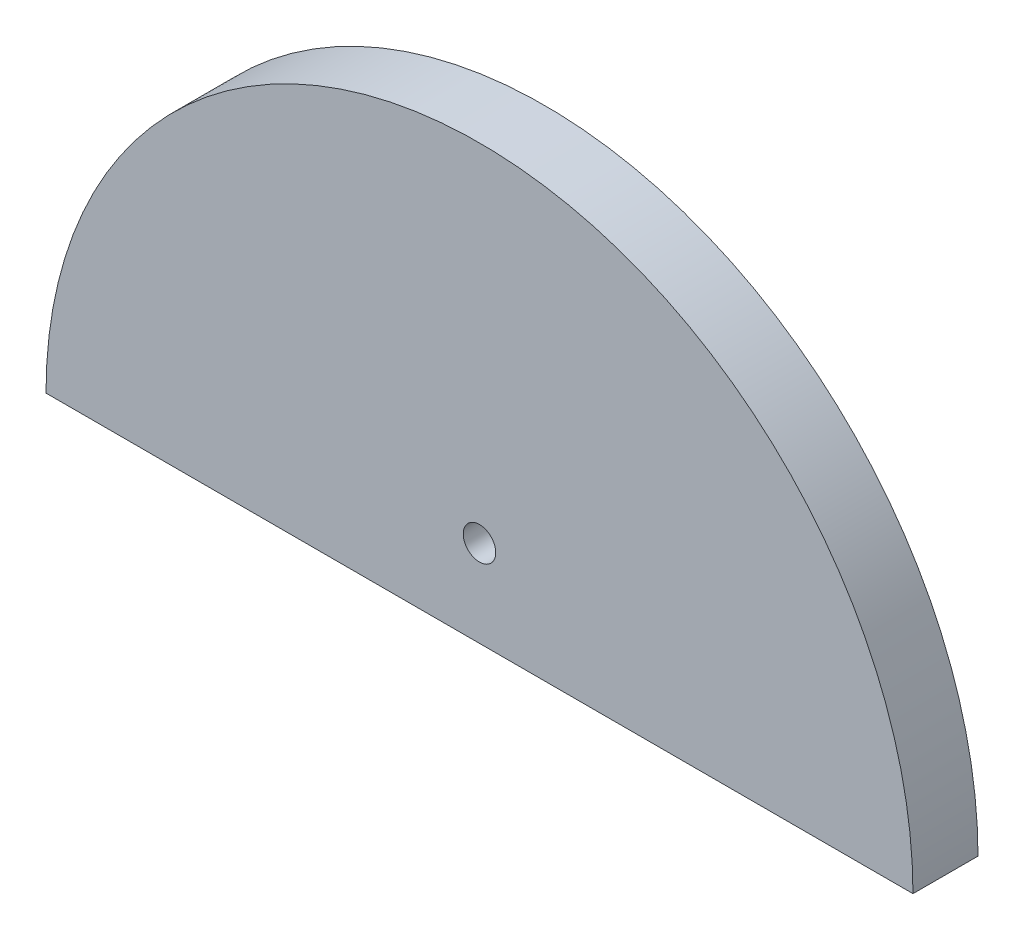
ISO-10303-21;
HEADER;
FILE_DESCRIPTION(('STEP AP214'),'2;1');
FILE_NAME('part.step','',(''),(''),'','','');
FILE_SCHEMA(('AUTOMOTIVE_DESIGN { 1 0 10303 214 1 1 1 1 }'));
ENDSEC;
DATA;
#1=APPLICATION_CONTEXT('core data for automotive mechanical design processes');
#2=APPLICATION_PROTOCOL_DEFINITION('international standard','automotive_design',2000,#1);
#3=PRODUCT_CONTEXT('',#1,'mechanical');
#4=PRODUCT('Part','Part','',(#3));
#5=PRODUCT_RELATED_PRODUCT_CATEGORY('part','',(#4));
#6=PRODUCT_DEFINITION_FORMATION('','',#4);
#7=PRODUCT_DEFINITION_CONTEXT('part definition',#1,'design');
#8=PRODUCT_DEFINITION('design','',#6,#7);
#9=PRODUCT_DEFINITION_SHAPE('','',#8);
#10=(LENGTH_UNIT() NAMED_UNIT(*) SI_UNIT(.MILLI.,.METRE.));
#11=(NAMED_UNIT(*) PLANE_ANGLE_UNIT() SI_UNIT($,.RADIAN.));
#12=(NAMED_UNIT(*) SI_UNIT($,.STERADIAN.) SOLID_ANGLE_UNIT());
#13=UNCERTAINTY_MEASURE_WITH_UNIT(LENGTH_MEASURE(1.E-05),#10,'distance_accuracy_value','');
#14=(GEOMETRIC_REPRESENTATION_CONTEXT(3) GLOBAL_UNCERTAINTY_ASSIGNED_CONTEXT((#13)) GLOBAL_UNIT_ASSIGNED_CONTEXT((#10,
#11,#12)) REPRESENTATION_CONTEXT('',''));
#15=CARTESIAN_POINT('',(0.,0.,0.));
#16=DIRECTION('',(0.,0.,1.));
#17=DIRECTION('',(1.,0.,0.));
#18=AXIS2_PLACEMENT_3D('',#15,#16,#17);
#19=CARTESIAN_POINT('',(0.,0.,3.));
#20=DIRECTION('',(0.,0.,-1.));
#21=DIRECTION('',(-1.,0.,0.));
#22=AXIS2_PLACEMENT_3D('',#19,#20,#21);
#23=CYLINDRICAL_SURFACE('',#22,20.);
#24=CARTESIAN_POINT('',(0.,0.,0.));
#25=DIRECTION('',(0.,0.,1.));
#26=DIRECTION('',(1.,0.,0.));
#27=AXIS2_PLACEMENT_3D('',#24,#25,#26);
#28=CIRCLE('',#27,20.);
#29=CARTESIAN_POINT('',(20.,0.,0.));
#30=VERTEX_POINT('',#29);
#31=CARTESIAN_POINT('',(-20.,0.,0.));
#32=VERTEX_POINT('',#31);
#33=EDGE_CURVE('E64',#30,#32,#28,.T.);
#34=ORIENTED_EDGE('',*,*,#33,.T.);
#35=DIRECTION('',(0.,0.,-1.));
#36=VECTOR('',#35,1.);
#37=CARTESIAN_POINT('',(-20.,0.,3.));
#38=LINE('',#37,#36);
#39=CARTESIAN_POINT('',(-20.,0.,3.));
#40=VERTEX_POINT('',#39);
#41=EDGE_CURVE('E11',#40,#32,#38,.T.);
#42=ORIENTED_EDGE('',*,*,#41,.F.);
#43=CARTESIAN_POINT('',(0.,0.,3.));
#44=DIRECTION('',(0.,0.,1.));
#45=DIRECTION('',(1.,0.,0.));
#46=AXIS2_PLACEMENT_3D('',#43,#44,#45);
#47=CIRCLE('',#46,20.);
#48=CARTESIAN_POINT('',(20.,0.,3.));
#49=VERTEX_POINT('',#48);
#50=EDGE_CURVE('E63',#49,#40,#47,.T.);
#51=ORIENTED_EDGE('',*,*,#50,.F.);
#52=DIRECTION('',(0.,0.,-1.));
#53=VECTOR('',#52,1.);
#54=CARTESIAN_POINT('',(20.,0.,3.));
#55=LINE('',#54,#53);
#56=EDGE_CURVE('E41',#49,#30,#55,.T.);
#57=ORIENTED_EDGE('',*,*,#56,.T.);
#58=EDGE_LOOP('',(#34,#42,#51,#57));
#59=FACE_BOUND('',#58,.T.);
#60=ADVANCED_FACE('F33',(#59),#23,.T.);
#61=CARTESIAN_POINT('',(0.,0.,3.));
#62=DIRECTION('',(0.,1.,0.));
#63=DIRECTION('',(0.,0.,1.));
#64=AXIS2_PLACEMENT_3D('',#61,#62,#63);
#65=PLANE('',#64);
#66=DIRECTION('',(1.,0.,0.));
#67=VECTOR('',#66,1.);
#68=CARTESIAN_POINT('',(0.,0.,0.));
#69=LINE('',#68,#67);
#70=EDGE_CURVE('E56',#32,#30,#69,.T.);
#71=ORIENTED_EDGE('',*,*,#70,.T.);
#72=ORIENTED_EDGE('',*,*,#56,.F.);
#73=DIRECTION('',(1.,0.,0.));
#74=VECTOR('',#73,1.);
#75=CARTESIAN_POINT('',(0.,0.,3.));
#76=LINE('',#75,#74);
#77=EDGE_CURVE('E48',#40,#49,#76,.T.);
#78=ORIENTED_EDGE('',*,*,#77,.F.);
#79=ORIENTED_EDGE('',*,*,#41,.T.);
#80=EDGE_LOOP('',(#71,#72,#78,#79));
#81=FACE_BOUND('',#80,.T.);
#82=ADVANCED_FACE('F59',(#81),#65,.F.);
#83=CARTESIAN_POINT('',(0.,0.,3.));
#84=DIRECTION('',(0.,0.,1.));
#85=DIRECTION('',(1.,0.,0.));
#86=AXIS2_PLACEMENT_3D('',#83,#84,#85);
#87=PLANE('',#86);
#88=CARTESIAN_POINT('',(0.,4.,3.));
#89=DIRECTION('',(0.,0.,1.));
#90=DIRECTION('',(1.,0.,0.));
#91=AXIS2_PLACEMENT_3D('',#88,#89,#90);
#92=CIRCLE('',#91,0.749999999999987);
#93=CARTESIAN_POINT('',(0.749999999999987,4.,3.));
#94=VERTEX_POINT('',#93);
#95=EDGE_CURVE('E71',#94,#94,#92,.T.);
#96=ORIENTED_EDGE('',*,*,#95,.F.);
#97=EDGE_LOOP('',(#96));
#98=FACE_BOUND('',#97,.T.);
#99=ORIENTED_EDGE('',*,*,#50,.T.);
#100=ORIENTED_EDGE('',*,*,#77,.T.);
#101=EDGE_LOOP('',(#99,#100));
#102=FACE_BOUND('',#101,.T.);
#103=ADVANCED_FACE('F81',(#98,#102),#87,.T.);
#104=CARTESIAN_POINT('',(0.,0.,0.));
#105=DIRECTION('',(0.,0.,1.));
#106=DIRECTION('',(1.,0.,0.));
#107=AXIS2_PLACEMENT_3D('',#104,#105,#106);
#108=PLANE('',#107);
#109=CARTESIAN_POINT('',(0.,4.,0.));
#110=DIRECTION('',(0.,0.,1.));
#111=DIRECTION('',(1.,0.,0.));
#112=AXIS2_PLACEMENT_3D('',#109,#110,#111);
#113=CIRCLE('',#112,0.749999999999999);
#114=CARTESIAN_POINT('',(0.749999999999999,4.,0.));
#115=VERTEX_POINT('',#114);
#116=EDGE_CURVE('E68',#115,#115,#113,.T.);
#117=ORIENTED_EDGE('',*,*,#116,.T.);
#118=EDGE_LOOP('',(#117));
#119=FACE_BOUND('',#118,.T.);
#120=ORIENTED_EDGE('',*,*,#33,.F.);
#121=ORIENTED_EDGE('',*,*,#70,.F.);
#122=EDGE_LOOP('',(#120,#121));
#123=FACE_BOUND('',#122,.T.);
#124=ADVANCED_FACE('F67',(#119,#123),#108,.F.);
#125=CARTESIAN_POINT('',(0.,4.,3.));
#126=DIRECTION('',(0.,0.,1.));
#127=DIRECTION('',(1.,0.,0.));
#128=AXIS2_PLACEMENT_3D('',#125,#126,#127);
#129=CYLINDRICAL_SURFACE('',#128,0.749999999999993);
#130=ORIENTED_EDGE('',*,*,#116,.F.);
#131=EDGE_LOOP('',(#130));
#132=FACE_BOUND('',#131,.T.);
#133=ORIENTED_EDGE('',*,*,#95,.T.);
#134=EDGE_LOOP('',(#133));
#135=FACE_BOUND('',#134,.T.);
#136=ADVANCED_FACE('F79',(#132,#135),#129,.F.);
#137=CLOSED_SHELL('',(#60,#82,#103,#124,#136));
#138=MANIFOLD_SOLID_BREP('B2',#137);
#139=ADVANCED_BREP_SHAPE_REPRESENTATION('',(#18,#138),#14);
#140=SHAPE_DEFINITION_REPRESENTATION(#9,#139);
ENDSEC;
END-ISO-10303-21;
